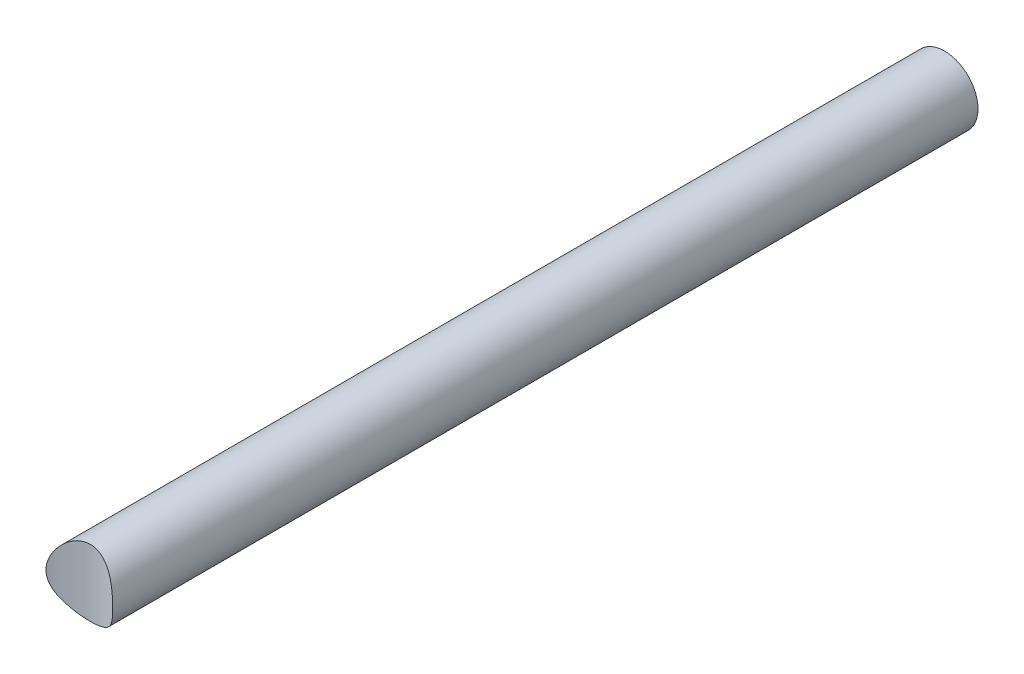
ISO-10303-21;
HEADER;
FILE_DESCRIPTION(('STEP AP214'),'2;1');
FILE_NAME('part.step','',(''),(''),'','','');
FILE_SCHEMA(('AUTOMOTIVE_DESIGN { 1 0 10303 214 1 1 1 1 }'));
ENDSEC;
DATA;
#1=APPLICATION_CONTEXT('core data for automotive mechanical design processes');
#2=APPLICATION_PROTOCOL_DEFINITION('international standard','automotive_design',2000,#1);
#3=PRODUCT_CONTEXT('',#1,'mechanical');
#4=PRODUCT('Part','Part','',(#3));
#5=PRODUCT_RELATED_PRODUCT_CATEGORY('part','',(#4));
#6=PRODUCT_DEFINITION_FORMATION('','',#4);
#7=PRODUCT_DEFINITION_CONTEXT('part definition',#1,'design');
#8=PRODUCT_DEFINITION('design','',#6,#7);
#9=PRODUCT_DEFINITION_SHAPE('','',#8);
#10=(LENGTH_UNIT() NAMED_UNIT(*) SI_UNIT(.MILLI.,.METRE.));
#11=(NAMED_UNIT(*) PLANE_ANGLE_UNIT() SI_UNIT($,.RADIAN.));
#12=(NAMED_UNIT(*) SI_UNIT($,.STERADIAN.) SOLID_ANGLE_UNIT());
#13=UNCERTAINTY_MEASURE_WITH_UNIT(LENGTH_MEASURE(1.E-05),#10,'distance_accuracy_value','');
#14=(GEOMETRIC_REPRESENTATION_CONTEXT(3) GLOBAL_UNCERTAINTY_ASSIGNED_CONTEXT((#13)) GLOBAL_UNIT_ASSIGNED_CONTEXT((#10,
#11,#12)) REPRESENTATION_CONTEXT('',''));
#15=CARTESIAN_POINT('',(0.,0.,0.));
#16=DIRECTION('',(0.,0.,1.));
#17=DIRECTION('',(1.,0.,0.));
#18=AXIS2_PLACEMENT_3D('',#15,#16,#17);
#19=CARTESIAN_POINT('',(27.271,-3.665,-10.931));
#20=DIRECTION('',(0.,1.,0.));
#21=DIRECTION('',(0.,0.,1.));
#22=AXIS2_PLACEMENT_3D('',#19,#20,#21);
#23=CYLINDRICAL_SURFACE('',#22,0.735);
#24=CARTESIAN_POINT('',(27.706,-0.535,-11.5234525297439));
#25=CARTESIAN_POINT('',(27.7059994352847,-0.556954222551313,-11.5234534390096));
#26=CARTESIAN_POINT('',(27.7043268812335,-0.57891237806569,-11.5246920268372));
#27=CARTESIAN_POINT('',(27.6977526655814,-0.622095927561948,-11.5294334576447));
#28=CARTESIAN_POINT('',(27.6928471063774,-0.643320404500126,-11.5329390335337));
#29=CARTESIAN_POINT('',(27.6801293676623,-0.684319099069375,-11.5416524529044));
#30=CARTESIAN_POINT('',(27.6723377743109,-0.704102428301185,-11.5468482090663));
#31=CARTESIAN_POINT('',(27.654133346517,-0.742069156262738,-11.5583352297038));
#32=CARTESIAN_POINT('',(27.6437197087901,-0.760252062381975,-11.5646268297176));
#33=CARTESIAN_POINT('',(27.6191262259246,-0.796869316262689,-11.5784990668321));
#34=CARTESIAN_POINT('',(27.6046461779773,-0.815077698580844,-11.5861440850156));
#35=CARTESIAN_POINT('',(27.5729470577753,-0.848994047177061,-11.601344971853));
#36=CARTESIAN_POINT('',(27.5557260425873,-0.86470022384603,-11.6089007731535));
#37=CARTESIAN_POINT('',(27.5168576937533,-0.894782702271872,-11.6240058720716));
#38=CARTESIAN_POINT('',(27.4949361942071,-0.908850320798863,-11.6314725986861));
#39=CARTESIAN_POINT('',(27.4485116275148,-0.932991404871281,-11.6446489129533));
#40=CARTESIAN_POINT('',(27.4240108739245,-0.943068411944317,-11.6503600576113));
#41=CARTESIAN_POINT('',(27.375542384212,-0.957938508714836,-11.6589036058913));
#42=CARTESIAN_POINT('',(27.3517387363221,-0.963137325194405,-11.6619551243489));
#43=CARTESIAN_POINT('',(27.303421146753,-0.96947199738723,-11.6656829088171));
#44=CARTESIAN_POINT('',(27.2789078700851,-0.970611540345753,-11.6663613304225));
#45=CARTESIAN_POINT('',(27.2330575548548,-0.968874705511524,-11.6653346195871));
#46=CARTESIAN_POINT('',(27.211694385842,-0.966466611709409,-11.6639073957247));
#47=CARTESIAN_POINT('',(27.1697399227505,-0.958588157734641,-11.659297127523));
#48=CARTESIAN_POINT('',(27.1491486855459,-0.953117572395494,-11.6561139540795));
#49=CARTESIAN_POINT('',(27.1091065506968,-0.93931110855871,-11.6482413888698));
#50=CARTESIAN_POINT('',(27.0896642868876,-0.930956141823125,-11.6435419768602));
#51=CARTESIAN_POINT('',(27.0524312398613,-0.911686345049644,-11.633016757377));
#52=CARTESIAN_POINT('',(27.0346409060775,-0.900770821204062,-11.6271906446882));
#53=CARTESIAN_POINT('',(26.9989731935747,-0.875238915003947,-11.6141019992858));
#54=CARTESIAN_POINT('',(26.9813319618416,-0.860338174760663,-11.606751111755));
#55=CARTESIAN_POINT('',(26.948651026612,-0.827994405222913,-11.5917873952382));
#56=CARTESIAN_POINT('',(26.9336148124126,-0.810548022876114,-11.5841742310508));
#57=CARTESIAN_POINT('',(26.9048846915582,-0.771305143727715,-11.568558088608));
#58=CARTESIAN_POINT('',(26.8915259743445,-0.749240646850454,-11.5606059018844));
#59=CARTESIAN_POINT('',(26.8687851034628,-0.702678767480242,-11.5463288048501));
#60=CARTESIAN_POINT('',(26.8593954556563,-0.678186078720378,-11.5400008367539));
#61=CARTESIAN_POINT('',(26.8469253245007,-0.633857509451484,-11.5313564352088));
#62=CARTESIAN_POINT('',(26.8428477095542,-0.614420928648871,-11.5284291272143));
#63=CARTESIAN_POINT('',(26.837386101084,-0.574990278248642,-11.5244776866217));
#64=CARTESIAN_POINT('',(26.8359994856351,-0.55499677057322,-11.523451701549));
#65=CARTESIAN_POINT('',(26.8360005647153,-0.513045777448687,-11.5234534390096));
#66=CARTESIAN_POINT('',(26.8376731187665,-0.49108762193431,-11.5246920268372));
#67=CARTESIAN_POINT('',(26.8442473344186,-0.447904072438052,-11.5294334576447));
#68=CARTESIAN_POINT('',(26.8491528936226,-0.426679595499874,-11.5329390335337));
#69=CARTESIAN_POINT('',(26.8618706323377,-0.385680900930625,-11.5416524529044));
#70=CARTESIAN_POINT('',(26.8696622256891,-0.365897571698814,-11.5468482090663));
#71=CARTESIAN_POINT('',(26.887866653483,-0.327930843737262,-11.5583352297038));
#72=CARTESIAN_POINT('',(26.8982802912099,-0.309747937618024,-11.5646268297176));
#73=CARTESIAN_POINT('',(26.9228737740754,-0.27313068373731,-11.5784990668321));
#74=CARTESIAN_POINT('',(26.9373538220227,-0.254922301419155,-11.5861440850156));
#75=CARTESIAN_POINT('',(26.9690529422247,-0.221005952822938,-11.601344971853));
#76=CARTESIAN_POINT('',(26.9862739574127,-0.20529977615397,-11.6089007731535));
#77=CARTESIAN_POINT('',(27.0251423062467,-0.175217297728128,-11.6240058720716));
#78=CARTESIAN_POINT('',(27.0470638057929,-0.161149679201137,-11.6314725986861));
#79=CARTESIAN_POINT('',(27.0934883724852,-0.137008595128719,-11.6446489129533));
#80=CARTESIAN_POINT('',(27.1179891260755,-0.126931588055683,-11.6503600576113));
#81=CARTESIAN_POINT('',(27.166457615788,-0.112061491285163,-11.6589036058913));
#82=CARTESIAN_POINT('',(27.1902612636779,-0.106862674805594,-11.6619551243489));
#83=CARTESIAN_POINT('',(27.238578853247,-0.10052800261277,-11.6656829088171));
#84=CARTESIAN_POINT('',(27.2630921299149,-0.0993884596542465,-11.6663613304225));
#85=CARTESIAN_POINT('',(27.3089424451452,-0.101125294488476,-11.6653346195871));
#86=CARTESIAN_POINT('',(27.330305614158,-0.103533388290592,-11.6639073957247));
#87=CARTESIAN_POINT('',(27.3722600772496,-0.111411842265359,-11.659297127523));
#88=CARTESIAN_POINT('',(27.3928513144541,-0.116882427604506,-11.6561139540795));
#89=CARTESIAN_POINT('',(27.4328934493032,-0.13068889144129,-11.6482413888698));
#90=CARTESIAN_POINT('',(27.4523357131124,-0.139043858176875,-11.6435419768602));
#91=CARTESIAN_POINT('',(27.4895687601387,-0.158313654950356,-11.633016757377));
#92=CARTESIAN_POINT('',(27.5073590939225,-0.169229178795938,-11.6271906446882));
#93=CARTESIAN_POINT('',(27.5430268064253,-0.194761084996053,-11.6141019992858));
#94=CARTESIAN_POINT('',(27.5606680381584,-0.209661825239337,-11.606751111755));
#95=CARTESIAN_POINT('',(27.593348973388,-0.242005594777087,-11.5917873952382));
#96=CARTESIAN_POINT('',(27.6083851875874,-0.259451977123886,-11.5841742310508));
#97=CARTESIAN_POINT('',(27.6371153084418,-0.298694856272285,-11.568558088608));
#98=CARTESIAN_POINT('',(27.6504740256555,-0.320759353149546,-11.5606059018844));
#99=CARTESIAN_POINT('',(27.6732148965372,-0.367321232519759,-11.5463288048501));
#100=CARTESIAN_POINT('',(27.6826045443437,-0.391813921279623,-11.5400008367539));
#101=CARTESIAN_POINT('',(27.6950746754993,-0.436142490548516,-11.5313564352088));
#102=CARTESIAN_POINT('',(27.6991522904458,-0.45557907135113,-11.5284291272143));
#103=CARTESIAN_POINT('',(27.704613898916,-0.495009721751358,-11.5244776866217));
#104=CARTESIAN_POINT('',(27.7060005143649,-0.51500322942678,-11.523451701549));
#105=CARTESIAN_POINT('',(27.706,-0.535,-11.5234525297439));
#106=B_SPLINE_CURVE_WITH_KNOTS('',3,(#24,#25,#26,#27,#28,#29,#30,#31,#32,#33,#34,#35,#36,#37,
#38,#39,#40,#41,#42,#43,#44,#45,#46,#47,#48,#49,#50,#51,#52,#53,#54,#55,#56,#57,#58,#59,#60,#61,
#62,#63,#64,#65,#66,#67,#68,#69,#70,#71,#72,#73,#74,#75,#76,#77,#78,#79,#80,#81,#82,#83,#84,#85,
#86,#87,#88,#89,#90,#91,#92,#93,#94,#95,#96,#97,#98,#99,#100,#101,#102,#103,#104,#105),
.UNSPECIFIED.,.T.,.F.,(4,2,2,2,2,2,2,2,2,2,2,2,2,2,2,2,2,2,2,2,2,2,2,2,2,2,2,2,2,2,2,2,2,2,2,2,
2,2,2,2,4),(0.,0.0657776139138671,0.13163467253878,0.197030744034767,0.26244687457087,
0.335621783250589,0.408848794847427,0.489699349619978,0.5704779906967,0.643709145150267,
0.716873763023103,0.781204208282166,0.845539383991416,0.910308747525195,0.975095681256825,
1.04750704995348,1.1200146727007,1.20058507251315,1.28100265756803,1.34097396030624,
1.40088680172958,1.46666441564345,1.53252147426836,1.59791754576435,1.66333367630045,
1.73650858498017,1.80973559657701,1.89058615134956,1.97136479242628,2.04459594687985,
2.11776056475269,2.18209101001175,2.246426185721,2.31119554925478,2.37598248298641,
2.44839385168306,2.52090147443028,2.60147187424273,2.68188945929761,2.74186076203583,
2.80177360345916),.UNSPECIFIED.);
#107=CARTESIAN_POINT('',(27.706,-0.535,-11.5234525297439));
#108=VERTEX_POINT('',#107);
#109=EDGE_CURVE('E18',#108,#108,#106,.T.);
#110=ORIENTED_EDGE('',*,*,#109,.F.);
#111=EDGE_LOOP('',(#110));
#112=FACE_BOUND('',#111,.T.);
#113=ADVANCED_FACE('F14',(#112),#23,.F.);
#114=CARTESIAN_POINT('',(27.271,-0.535,-22.8));
#115=DIRECTION('',(0.,0.,-1.));
#116=DIRECTION('',(-1.,0.,0.));
#117=AXIS2_PLACEMENT_3D('',#114,#115,#116);
#118=PLANE('',#117);
#119=CARTESIAN_POINT('',(27.271,-0.535,-22.8));
#120=DIRECTION('',(0.,0.,1.));
#121=DIRECTION('',(1.,0.,0.));
#122=AXIS2_PLACEMENT_3D('',#119,#120,#121);
#123=CIRCLE('',#122,0.435);
#124=CARTESIAN_POINT('',(27.706,-0.535,-22.8));
#125=VERTEX_POINT('',#124);
#126=EDGE_CURVE('E10',#125,#125,#123,.T.);
#127=ORIENTED_EDGE('',*,*,#126,.F.);
#128=EDGE_LOOP('',(#127));
#129=FACE_BOUND('',#128,.T.);
#130=ADVANCED_FACE('F33',(#129),#118,.T.);
#131=CARTESIAN_POINT('',(27.271,-0.535,-6.931));
#132=DIRECTION('',(0.,0.,1.));
#133=DIRECTION('',(1.,0.,0.));
#134=AXIS2_PLACEMENT_3D('',#131,#132,#133);
#135=CYLINDRICAL_SURFACE('',#134,0.435);
#136=ORIENTED_EDGE('',*,*,#109,.T.);
#137=EDGE_LOOP('',(#136));
#138=FACE_BOUND('',#137,.T.);
#139=ORIENTED_EDGE('',*,*,#126,.T.);
#140=EDGE_LOOP('',(#139));
#141=FACE_BOUND('',#140,.T.);
#142=ADVANCED_FACE('F30',(#138,#141),#135,.T.);
#143=CLOSED_SHELL('',(#113,#130,#142));
#144=MANIFOLD_SOLID_BREP('B1',#143);
#145=ADVANCED_BREP_SHAPE_REPRESENTATION('',(#18,#144),#14);
#146=SHAPE_DEFINITION_REPRESENTATION(#9,#145);
ENDSEC;
END-ISO-10303-21;
